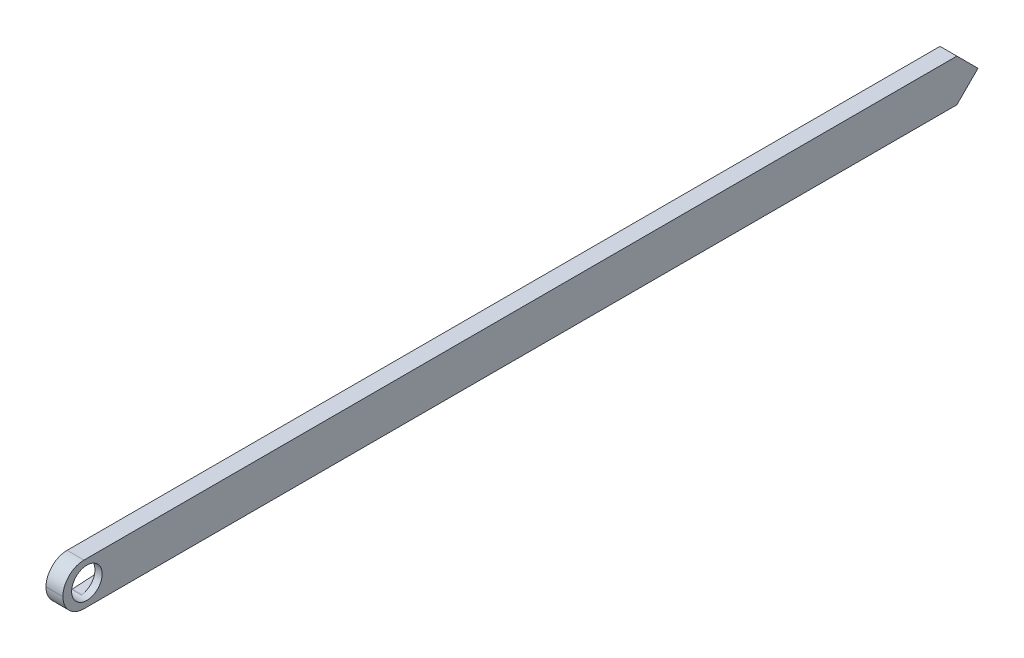
ISO-10303-21;
HEADER;
FILE_DESCRIPTION(('STEP AP214'),'2;1');
FILE_NAME('part.step','',(''),(''),'','','');
FILE_SCHEMA(('AUTOMOTIVE_DESIGN { 1 0 10303 214 1 1 1 1 }'));
ENDSEC;
DATA;
#1=APPLICATION_CONTEXT('core data for automotive mechanical design processes');
#2=APPLICATION_PROTOCOL_DEFINITION('international standard','automotive_design',2000,#1);
#3=PRODUCT_CONTEXT('',#1,'mechanical');
#4=PRODUCT('Part','Part','',(#3));
#5=PRODUCT_RELATED_PRODUCT_CATEGORY('part','',(#4));
#6=PRODUCT_DEFINITION_FORMATION('','',#4);
#7=PRODUCT_DEFINITION_CONTEXT('part definition',#1,'design');
#8=PRODUCT_DEFINITION('design','',#6,#7);
#9=PRODUCT_DEFINITION_SHAPE('','',#8);
#10=(LENGTH_UNIT() NAMED_UNIT(*) SI_UNIT(.MILLI.,.METRE.));
#11=(NAMED_UNIT(*) PLANE_ANGLE_UNIT() SI_UNIT($,.RADIAN.));
#12=(NAMED_UNIT(*) SI_UNIT($,.STERADIAN.) SOLID_ANGLE_UNIT());
#13=UNCERTAINTY_MEASURE_WITH_UNIT(LENGTH_MEASURE(1.E-05),#10,'distance_accuracy_value','');
#14=(GEOMETRIC_REPRESENTATION_CONTEXT(3) GLOBAL_UNCERTAINTY_ASSIGNED_CONTEXT((#13)) GLOBAL_UNIT_ASSIGNED_CONTEXT((#10,
#11,#12)) REPRESENTATION_CONTEXT('',''));
#15=CARTESIAN_POINT('',(0.,0.,0.));
#16=DIRECTION('',(0.,0.,1.));
#17=DIRECTION('',(1.,0.,0.));
#18=AXIS2_PLACEMENT_3D('',#15,#16,#17);
#19=CARTESIAN_POINT('',(4.,0.,0.));
#20=DIRECTION('',(0.,1.,0.));
#21=DIRECTION('',(0.,0.,1.));
#22=AXIS2_PLACEMENT_3D('',#19,#20,#21);
#23=PLANE('',#22);
#24=DIRECTION('',(0.,0.,-1.));
#25=VECTOR('',#24,1.);
#26=CARTESIAN_POINT('',(4.,0.,0.));
#27=LINE('',#26,#25);
#28=CARTESIAN_POINT('',(4.,0.,-5.));
#29=VERTEX_POINT('',#28);
#30=CARTESIAN_POINT('',(4.,0.,-211.86));
#31=VERTEX_POINT('',#30);
#32=EDGE_CURVE('E170',#29,#31,#27,.T.);
#33=ORIENTED_EDGE('',*,*,#32,.F.);
#34=DIRECTION('',(-1.,0.,0.));
#35=VECTOR('',#34,1.);
#36=CARTESIAN_POINT('',(0.,0.,-5.));
#37=LINE('',#36,#35);
#38=CARTESIAN_POINT('',(0.,0.,-5.));
#39=VERTEX_POINT('',#38);
#40=EDGE_CURVE('E208',#29,#39,#37,.T.);
#41=ORIENTED_EDGE('',*,*,#40,.T.);
#42=DIRECTION('',(0.,0.,-1.));
#43=VECTOR('',#42,1.);
#44=CARTESIAN_POINT('',(0.,0.,0.));
#45=LINE('',#44,#43);
#46=CARTESIAN_POINT('',(0.,0.,-211.86));
#47=VERTEX_POINT('',#46);
#48=EDGE_CURVE('E167',#39,#47,#45,.T.);
#49=ORIENTED_EDGE('',*,*,#48,.T.);
#50=DIRECTION('',(-1.,0.,0.));
#51=VECTOR('',#50,1.);
#52=CARTESIAN_POINT('',(4.,0.,-211.86));
#53=LINE('',#52,#51);
#54=EDGE_CURVE('E194',#31,#47,#53,.T.);
#55=ORIENTED_EDGE('',*,*,#54,.F.);
#56=EDGE_LOOP('',(#33,#41,#49,#55));
#57=FACE_BOUND('',#56,.T.);
#58=ADVANCED_FACE('F44',(#57),#23,.F.);
#59=CARTESIAN_POINT('',(4.,-105.93,-105.93));
#60=DIRECTION('',(0.,-0.707106781186548,-0.707106781186547));
#61=DIRECTION('',(0.,0.707106781186547,-0.707106781186548));
#62=AXIS2_PLACEMENT_3D('',#59,#60,#61);
#63=PLANE('',#62);
#64=DIRECTION('',(0.,-0.707106781186547,0.707106781186548));
#65=VECTOR('',#64,1.);
#66=CARTESIAN_POINT('',(0.,-105.93,-105.93));
#67=LINE('',#66,#65);
#68=CARTESIAN_POINT('',(0.,5.,-216.86));
#69=VERTEX_POINT('',#68);
#70=EDGE_CURVE('E183',#69,#47,#67,.T.);
#71=ORIENTED_EDGE('',*,*,#70,.F.);
#72=DIRECTION('',(-1.,0.,0.));
#73=VECTOR('',#72,1.);
#74=CARTESIAN_POINT('',(4.,5.,-216.86));
#75=LINE('',#74,#73);
#76=CARTESIAN_POINT('',(4.,5.,-216.86));
#77=VERTEX_POINT('',#76);
#78=EDGE_CURVE('E192',#77,#69,#75,.T.);
#79=ORIENTED_EDGE('',*,*,#78,.F.);
#80=DIRECTION('',(0.,-0.707106781186547,0.707106781186548));
#81=VECTOR('',#80,1.);
#82=CARTESIAN_POINT('',(4.,-105.93,-105.93));
#83=LINE('',#82,#81);
#84=EDGE_CURVE('E172',#77,#31,#83,.T.);
#85=ORIENTED_EDGE('',*,*,#84,.T.);
#86=ORIENTED_EDGE('',*,*,#54,.T.);
#87=EDGE_LOOP('',(#71,#79,#85,#86));
#88=FACE_BOUND('',#87,.T.);
#89=ADVANCED_FACE('F253',(#88),#63,.T.);
#90=CARTESIAN_POINT('',(4.,110.93,-110.93));
#91=DIRECTION('',(0.,0.707106781186548,-0.707106781186547));
#92=DIRECTION('',(0.,0.707106781186547,0.707106781186548));
#93=AXIS2_PLACEMENT_3D('',#90,#91,#92);
#94=PLANE('',#93);
#95=DIRECTION('',(0.,-0.707106781186547,-0.707106781186548));
#96=VECTOR('',#95,1.);
#97=CARTESIAN_POINT('',(0.,110.93,-110.93));
#98=LINE('',#97,#96);
#99=CARTESIAN_POINT('',(0.,10.,-211.86));
#100=VERTEX_POINT('',#99);
#101=EDGE_CURVE('E186',#100,#69,#98,.T.);
#102=ORIENTED_EDGE('',*,*,#101,.F.);
#103=DIRECTION('',(-1.,0.,0.));
#104=VECTOR('',#103,1.);
#105=CARTESIAN_POINT('',(4.,10.,-211.86));
#106=LINE('',#105,#104);
#107=CARTESIAN_POINT('',(4.,10.,-211.86));
#108=VERTEX_POINT('',#107);
#109=EDGE_CURVE('E181',#108,#100,#106,.T.);
#110=ORIENTED_EDGE('',*,*,#109,.F.);
#111=DIRECTION('',(0.,-0.707106781186547,-0.707106781186548));
#112=VECTOR('',#111,1.);
#113=CARTESIAN_POINT('',(4.,110.93,-110.93));
#114=LINE('',#113,#112);
#115=EDGE_CURVE('E176',#108,#77,#114,.T.);
#116=ORIENTED_EDGE('',*,*,#115,.T.);
#117=ORIENTED_EDGE('',*,*,#78,.T.);
#118=EDGE_LOOP('',(#102,#110,#116,#117));
#119=FACE_BOUND('',#118,.T.);
#120=ADVANCED_FACE('F261',(#119),#94,.T.);
#121=CARTESIAN_POINT('',(4.,10.,0.));
#122=DIRECTION('',(0.,1.,0.));
#123=DIRECTION('',(0.,0.,1.));
#124=AXIS2_PLACEMENT_3D('',#121,#122,#123);
#125=PLANE('',#124);
#126=DIRECTION('',(0.,0.,-1.));
#127=VECTOR('',#126,1.);
#128=CARTESIAN_POINT('',(0.,10.,0.));
#129=LINE('',#128,#127);
#130=CARTESIAN_POINT('',(0.,10.,-5.));
#131=VERTEX_POINT('',#130);
#132=EDGE_CURVE('E173',#131,#100,#129,.T.);
#133=ORIENTED_EDGE('',*,*,#132,.F.);
#134=DIRECTION('',(-1.,0.,0.));
#135=VECTOR('',#134,1.);
#136=CARTESIAN_POINT('',(4.,10.,-5.));
#137=LINE('',#136,#135);
#138=CARTESIAN_POINT('',(4.,10.,-5.));
#139=VERTEX_POINT('',#138);
#140=EDGE_CURVE('E201',#131,#139,#137,.F.);
#141=ORIENTED_EDGE('',*,*,#140,.T.);
#142=DIRECTION('',(0.,0.,-1.));
#143=VECTOR('',#142,1.);
#144=CARTESIAN_POINT('',(4.,10.,0.));
#145=LINE('',#144,#143);
#146=EDGE_CURVE('E179',#139,#108,#145,.T.);
#147=ORIENTED_EDGE('',*,*,#146,.T.);
#148=ORIENTED_EDGE('',*,*,#109,.T.);
#149=EDGE_LOOP('',(#133,#141,#147,#148));
#150=FACE_BOUND('',#149,.T.);
#151=ADVANCED_FACE('F347',(#150),#125,.T.);
#152=CARTESIAN_POINT('',(4.,0.,0.));
#153=DIRECTION('',(1.,0.,0.));
#154=DIRECTION('',(0.,0.,-1.));
#155=AXIS2_PLACEMENT_3D('',#152,#153,#154);
#156=PLANE('',#155);
#157=CARTESIAN_POINT('',(4.,5.,-5.68959999999999));
#158=DIRECTION('',(-1.,0.,0.));
#159=DIRECTION('',(0.,0.,1.));
#160=AXIS2_PLACEMENT_3D('',#157,#158,#159);
#161=CIRCLE('',#160,3.61);
#162=CARTESIAN_POINT('',(4.,5.,-2.07959999999999));
#163=VERTEX_POINT('',#162);
#164=EDGE_CURVE('E164',#163,#163,#161,.T.);
#165=ORIENTED_EDGE('',*,*,#164,.T.);
#166=EDGE_LOOP('',(#165));
#167=FACE_BOUND('',#166,.T.);
#168=ORIENTED_EDGE('',*,*,#146,.F.);
#169=CARTESIAN_POINT('',(4.,5.,-5.));
#170=DIRECTION('',(1.,0.,0.));
#171=DIRECTION('',(0.,0.,-1.));
#172=AXIS2_PLACEMENT_3D('',#169,#170,#171);
#173=CIRCLE('',#172,5.);
#174=CARTESIAN_POINT('',(4.,5.,0.));
#175=VERTEX_POINT('',#174);
#176=EDGE_CURVE('E206',#139,#175,#173,.T.);
#177=ORIENTED_EDGE('',*,*,#176,.T.);
#178=CARTESIAN_POINT('',(4.,5.,-5.));
#179=DIRECTION('',(1.,0.,0.));
#180=DIRECTION('',(0.,0.,-1.));
#181=AXIS2_PLACEMENT_3D('',#178,#179,#180);
#182=CIRCLE('',#181,5.);
#183=EDGE_CURVE('E204',#175,#29,#182,.T.);
#184=ORIENTED_EDGE('',*,*,#183,.T.);
#185=ORIENTED_EDGE('',*,*,#32,.T.);
#186=ORIENTED_EDGE('',*,*,#84,.F.);
#187=ORIENTED_EDGE('',*,*,#115,.F.);
#188=EDGE_LOOP('',(#168,#177,#184,#185,#186,#187));
#189=FACE_BOUND('',#188,.T.);
#190=ADVANCED_FACE('F336',(#167,#189),#156,.T.);
#191=CARTESIAN_POINT('',(0.,0.,0.));
#192=DIRECTION('',(1.,0.,0.));
#193=DIRECTION('',(0.,0.,-1.));
#194=AXIS2_PLACEMENT_3D('',#191,#192,#193);
#195=PLANE('',#194);
#196=CARTESIAN_POINT('',(0.,5.,-5.68959999999999));
#197=DIRECTION('',(-1.,0.,0.));
#198=DIRECTION('',(0.,0.,1.));
#199=AXIS2_PLACEMENT_3D('',#196,#197,#198);
#200=CIRCLE('',#199,3.61);
#201=CARTESIAN_POINT('',(0.,1.41422947388331,-6.10715207343855));
#202=VERTEX_POINT('',#201);
#203=CARTESIAN_POINT('',(0.,8.58577052611669,-6.10715207343855));
#204=VERTEX_POINT('',#203);
#205=EDGE_CURVE('E163',#202,#204,#200,.T.);
#206=ORIENTED_EDGE('',*,*,#205,.F.);
#207=CARTESIAN_POINT('',(0.,-0.572346994879395,-6.33848286204717));
#208=DIRECTION('',(1.,0.,0.));
#209=DIRECTION('',(0.,0.,-1.));
#210=AXIS2_PLACEMENT_3D('',#207,#208,#209);
#211=CIRCLE('',#210,2.);
#212=CARTESIAN_POINT('',(0.,1.42370032577866,-6.21280432890096));
#213=VERTEX_POINT('',#212);
#214=EDGE_CURVE('E220',#202,#213,#211,.F.);
#215=ORIENTED_EDGE('',*,*,#214,.T.);
#216=DIRECTION('',(0.,-0.062839266573108,0.998023660329029));
#217=VECTOR('',#216,1.);
#218=CARTESIAN_POINT('',(0.,1.02844196733036,0.0647545158586101));
#219=LINE('',#218,#217);
#220=CARTESIAN_POINT('',(0.,2.495,-23.2273635445432));
#221=VERTEX_POINT('',#220);
#222=EDGE_CURVE('E150',#221,#213,#219,.T.);
#223=ORIENTED_EDGE('',*,*,#222,.F.);
#224=CARTESIAN_POINT('',(0.,5.,-23.0696394654229));
#225=DIRECTION('',(-1.,0.,0.));
#226=DIRECTION('',(0.,0.,1.));
#227=AXIS2_PLACEMENT_3D('',#224,#225,#226);
#228=CIRCLE('',#227,2.50996053457706);
#229=CARTESIAN_POINT('',(0.,7.505,-23.2273635445432));
#230=VERTEX_POINT('',#229);
#231=EDGE_CURVE('E146',#230,#221,#228,.T.);
#232=ORIENTED_EDGE('',*,*,#231,.F.);
#233=DIRECTION('',(0.,-0.062839266573108,-0.998023660329029));
#234=VECTOR('',#233,1.);
#235=CARTESIAN_POINT('',(0.,8.93207029843518,-0.562396232518238));
#236=LINE('',#235,#234);
#237=CARTESIAN_POINT('',(0.,8.57629967422134,-6.21280432890096));
#238=VERTEX_POINT('',#237);
#239=EDGE_CURVE('E155',#238,#230,#236,.T.);
#240=ORIENTED_EDGE('',*,*,#239,.F.);
#241=CARTESIAN_POINT('',(0.,10.5723469948794,-6.33848286204717));
#242=DIRECTION('',(1.,0.,0.));
#243=DIRECTION('',(0.,0.,-1.));
#244=AXIS2_PLACEMENT_3D('',#241,#242,#243);
#245=CIRCLE('',#244,2.);
#246=EDGE_CURVE('E218',#238,#204,#245,.F.);
#247=ORIENTED_EDGE('',*,*,#246,.T.);
#248=EDGE_LOOP('',(#206,#215,#223,#232,#240,#247));
#249=FACE_BOUND('',#248,.T.);
#250=CARTESIAN_POINT('',(0.,5.,-5.));
#251=DIRECTION('',(1.,0.,0.));
#252=DIRECTION('',(0.,0.,-1.));
#253=AXIS2_PLACEMENT_3D('',#250,#251,#252);
#254=CIRCLE('',#253,5.);
#255=CARTESIAN_POINT('',(0.,5.,0.));
#256=VERTEX_POINT('',#255);
#257=EDGE_CURVE('E197',#39,#256,#254,.F.);
#258=ORIENTED_EDGE('',*,*,#257,.T.);
#259=CARTESIAN_POINT('',(0.,5.,-5.));
#260=DIRECTION('',(1.,0.,0.));
#261=DIRECTION('',(0.,0.,-1.));
#262=AXIS2_PLACEMENT_3D('',#259,#260,#261);
#263=CIRCLE('',#262,5.);
#264=EDGE_CURVE('E199',#256,#131,#263,.F.);
#265=ORIENTED_EDGE('',*,*,#264,.T.);
#266=ORIENTED_EDGE('',*,*,#132,.T.);
#267=ORIENTED_EDGE('',*,*,#101,.T.);
#268=ORIENTED_EDGE('',*,*,#70,.T.);
#269=ORIENTED_EDGE('',*,*,#48,.F.);
#270=EDGE_LOOP('',(#258,#265,#266,#267,#268,#269));
#271=FACE_BOUND('',#270,.T.);
#272=ADVANCED_FACE('F233',(#249,#271),#195,.F.);
#273=CARTESIAN_POINT('',(4.,5.,-5.68959999999999));
#274=DIRECTION('',(-1.,0.,0.));
#275=DIRECTION('',(0.,0.,1.));
#276=AXIS2_PLACEMENT_3D('',#273,#274,#275);
#277=CYLINDRICAL_SURFACE('',#276,3.61);
#278=ORIENTED_EDGE('',*,*,#164,.F.);
#279=EDGE_LOOP('',(#278));
#280=FACE_BOUND('',#279,.T.);
#281=CARTESIAN_POINT('',(2.3,5.,-5.68959999999999));
#282=DIRECTION('',(1.,0.,0.));
#283=DIRECTION('',(0.,0.,-1.));
#284=AXIS2_PLACEMENT_3D('',#281,#282,#283);
#285=CIRCLE('',#284,3.61);
#286=CARTESIAN_POINT('',(2.3,8.58577052611669,-6.10715207343855));
#287=VERTEX_POINT('',#286);
#288=CARTESIAN_POINT('',(2.3,1.41422947388331,-6.10715207343855));
#289=VERTEX_POINT('',#288);
#290=EDGE_CURVE('E159',#287,#289,#285,.F.);
#291=ORIENTED_EDGE('',*,*,#290,.T.);
#292=DIRECTION('',(-1.,0.,0.));
#293=VECTOR('',#292,1.);
#294=CARTESIAN_POINT('',(4.,1.41422947388331,-6.10715207343855));
#295=LINE('',#294,#293);
#296=EDGE_CURVE('E215',#289,#202,#295,.T.);
#297=ORIENTED_EDGE('',*,*,#296,.T.);
#298=ORIENTED_EDGE('',*,*,#205,.T.);
#299=DIRECTION('',(-1.,0.,0.));
#300=VECTOR('',#299,1.);
#301=CARTESIAN_POINT('',(4.,8.58577052611669,-6.10715207343855));
#302=LINE('',#301,#300);
#303=EDGE_CURVE('E210',#204,#287,#302,.F.);
#304=ORIENTED_EDGE('',*,*,#303,.T.);
#305=EDGE_LOOP('',(#291,#297,#298,#304));
#306=FACE_BOUND('',#305,.T.);
#307=ADVANCED_FACE('F230',(#280,#306),#277,.F.);
#308=CARTESIAN_POINT('',(2.3,0.,0.));
#309=DIRECTION('',(1.,0.,0.));
#310=DIRECTION('',(0.,0.,-1.));
#311=AXIS2_PLACEMENT_3D('',#308,#309,#310);
#312=PLANE('',#311);
#313=ORIENTED_EDGE('',*,*,#290,.F.);
#314=CARTESIAN_POINT('',(2.3,10.5723469948794,-6.33848286204717));
#315=DIRECTION('',(1.,0.,0.));
#316=DIRECTION('',(0.,0.,-1.));
#317=AXIS2_PLACEMENT_3D('',#314,#315,#316);
#318=CIRCLE('',#317,2.);
#319=CARTESIAN_POINT('',(2.3,8.57629967422134,-6.21280432890096));
#320=VERTEX_POINT('',#319);
#321=EDGE_CURVE('E12',#287,#320,#318,.T.);
#322=ORIENTED_EDGE('',*,*,#321,.T.);
#323=DIRECTION('',(0.,-0.062839266573108,-0.998023660329029));
#324=VECTOR('',#323,1.);
#325=CARTESIAN_POINT('',(2.3,8.93207029843518,-0.562396232518238));
#326=LINE('',#325,#324);
#327=CARTESIAN_POINT('',(2.3,7.505,-23.2273635445432));
#328=VERTEX_POINT('',#327);
#329=EDGE_CURVE('E137',#320,#328,#326,.T.);
#330=ORIENTED_EDGE('',*,*,#329,.T.);
#331=CARTESIAN_POINT('',(2.3,5.,-23.0696394654229));
#332=DIRECTION('',(1.,0.,0.));
#333=DIRECTION('',(0.,0.,-1.));
#334=AXIS2_PLACEMENT_3D('',#331,#332,#333);
#335=CIRCLE('',#334,2.50996053457706);
#336=CARTESIAN_POINT('',(2.30000000000001,2.495,-23.2273635445432));
#337=VERTEX_POINT('',#336);
#338=EDGE_CURVE('E143',#328,#337,#335,.F.);
#339=ORIENTED_EDGE('',*,*,#338,.T.);
#340=DIRECTION('',(0.,-0.062839266573108,0.998023660329029));
#341=VECTOR('',#340,1.);
#342=CARTESIAN_POINT('',(2.3,1.02844196733036,0.0647545158586101));
#343=LINE('',#342,#341);
#344=CARTESIAN_POINT('',(2.3,1.42370032577866,-6.21280432890096));
#345=VERTEX_POINT('',#344);
#346=EDGE_CURVE('E129',#337,#345,#343,.T.);
#347=ORIENTED_EDGE('',*,*,#346,.T.);
#348=CARTESIAN_POINT('',(2.3,-0.572346994879395,-6.33848286204717));
#349=DIRECTION('',(1.,0.,0.));
#350=DIRECTION('',(0.,0.,-1.));
#351=AXIS2_PLACEMENT_3D('',#348,#349,#350);
#352=CIRCLE('',#351,2.);
#353=EDGE_CURVE('E52',#345,#289,#352,.T.);
#354=ORIENTED_EDGE('',*,*,#353,.T.);
#355=EDGE_LOOP('',(#313,#322,#330,#339,#347,#354));
#356=FACE_BOUND('',#355,.T.);
#357=ADVANCED_FACE('F149',(#356),#312,.F.);
#358=CARTESIAN_POINT('',(24.703095664644,5.,-23.0696394654229));
#359=DIRECTION('',(-1.,0.,0.));
#360=DIRECTION('',(0.,0.,1.));
#361=AXIS2_PLACEMENT_3D('',#358,#359,#360);
#362=CYLINDRICAL_SURFACE('',#361,2.50996053457706);
#363=DIRECTION('',(-1.,0.,0.));
#364=VECTOR('',#363,1.);
#365=CARTESIAN_POINT('',(24.703095664644,7.505,-23.2273635445432));
#366=LINE('',#365,#364);
#367=EDGE_CURVE('E158',#328,#230,#366,.T.);
#368=ORIENTED_EDGE('',*,*,#367,.T.);
#369=ORIENTED_EDGE('',*,*,#231,.T.);
#370=DIRECTION('',(-1.,0.,0.));
#371=VECTOR('',#370,1.);
#372=CARTESIAN_POINT('',(24.703095664644,2.495,-23.2273635445432));
#373=LINE('',#372,#371);
#374=EDGE_CURVE('E132',#337,#221,#373,.T.);
#375=ORIENTED_EDGE('',*,*,#374,.F.);
#376=ORIENTED_EDGE('',*,*,#338,.F.);
#377=EDGE_LOOP('',(#368,#369,#375,#376));
#378=FACE_BOUND('',#377,.T.);
#379=ADVANCED_FACE('F142',(#378),#362,.F.);
#380=CARTESIAN_POINT('',(24.703095664644,1.02844196733036,0.0647545158586101));
#381=DIRECTION('',(0.,-0.998023660329029,-0.062839266573108));
#382=DIRECTION('',(0.,0.062839266573108,-0.998023660329029));
#383=AXIS2_PLACEMENT_3D('',#380,#381,#382);
#384=PLANE('',#383);
#385=ORIENTED_EDGE('',*,*,#222,.T.);
#386=DIRECTION('',(-1.,0.,0.));
#387=VECTOR('',#386,1.);
#388=CARTESIAN_POINT('',(24.703095664644,1.42370032577866,-6.21280432890096));
#389=LINE('',#388,#387);
#390=EDGE_CURVE('E65',#213,#345,#389,.F.);
#391=ORIENTED_EDGE('',*,*,#390,.T.);
#392=ORIENTED_EDGE('',*,*,#346,.F.);
#393=ORIENTED_EDGE('',*,*,#374,.T.);
#394=EDGE_LOOP('',(#385,#391,#392,#393));
#395=FACE_BOUND('',#394,.T.);
#396=ADVANCED_FACE('F131',(#395),#384,.F.);
#397=CARTESIAN_POINT('',(24.703095664644,8.93207029843518,-0.562396232518238));
#398=DIRECTION('',(0.,0.998023660329029,-0.062839266573108));
#399=DIRECTION('',(0.,0.062839266573108,0.998023660329029));
#400=AXIS2_PLACEMENT_3D('',#397,#398,#399);
#401=PLANE('',#400);
#402=ORIENTED_EDGE('',*,*,#329,.F.);
#403=DIRECTION('',(-1.,0.,0.));
#404=VECTOR('',#403,1.);
#405=CARTESIAN_POINT('',(24.703095664644,8.57629967422134,-6.21280432890096));
#406=LINE('',#405,#404);
#407=EDGE_CURVE('E223',#320,#238,#406,.T.);
#408=ORIENTED_EDGE('',*,*,#407,.T.);
#409=ORIENTED_EDGE('',*,*,#239,.T.);
#410=ORIENTED_EDGE('',*,*,#367,.F.);
#411=EDGE_LOOP('',(#402,#408,#409,#410));
#412=FACE_BOUND('',#411,.T.);
#413=ADVANCED_FACE('F239',(#412),#401,.F.);
#414=CARTESIAN_POINT('',(4.,5.,-5.));
#415=DIRECTION('',(1.,0.,0.));
#416=DIRECTION('',(0.,0.,-1.));
#417=AXIS2_PLACEMENT_3D('',#414,#415,#416);
#418=CYLINDRICAL_SURFACE('',#417,5.);
#419=ORIENTED_EDGE('',*,*,#40,.F.);
#420=ORIENTED_EDGE('',*,*,#183,.F.);
#421=DIRECTION('',(-1.,0.,0.));
#422=VECTOR('',#421,1.);
#423=CARTESIAN_POINT('',(4.,5.,0.));
#424=LINE('',#423,#422);
#425=EDGE_CURVE('E160',#256,#175,#424,.F.);
#426=ORIENTED_EDGE('',*,*,#425,.F.);
#427=ORIENTED_EDGE('',*,*,#257,.F.);
#428=EDGE_LOOP('',(#419,#420,#426,#427));
#429=FACE_BOUND('',#428,.T.);
#430=ADVANCED_FACE('F241',(#429),#418,.T.);
#431=CARTESIAN_POINT('',(4.,5.,-5.));
#432=DIRECTION('',(-1.,0.,0.));
#433=DIRECTION('',(0.,0.,1.));
#434=AXIS2_PLACEMENT_3D('',#431,#432,#433);
#435=CYLINDRICAL_SURFACE('',#434,5.);
#436=ORIENTED_EDGE('',*,*,#176,.F.);
#437=ORIENTED_EDGE('',*,*,#140,.F.);
#438=ORIENTED_EDGE('',*,*,#264,.F.);
#439=ORIENTED_EDGE('',*,*,#425,.T.);
#440=EDGE_LOOP('',(#436,#437,#438,#439));
#441=FACE_BOUND('',#440,.T.);
#442=ADVANCED_FACE('F248',(#441),#435,.T.);
#443=CARTESIAN_POINT('',(4.,-0.572346994879395,-6.33848286204717));
#444=DIRECTION('',(-1.,0.,0.));
#445=DIRECTION('',(0.,0.,1.));
#446=AXIS2_PLACEMENT_3D('',#443,#444,#445);
#447=CYLINDRICAL_SURFACE('',#446,2.);
#448=ORIENTED_EDGE('',*,*,#353,.F.);
#449=ORIENTED_EDGE('',*,*,#390,.F.);
#450=ORIENTED_EDGE('',*,*,#214,.F.);
#451=ORIENTED_EDGE('',*,*,#296,.F.);
#452=EDGE_LOOP('',(#448,#449,#450,#451));
#453=FACE_BOUND('',#452,.T.);
#454=ADVANCED_FACE('F227',(#453),#447,.T.);
#455=CARTESIAN_POINT('',(4.,10.5723469948794,-6.33848286204717));
#456=DIRECTION('',(-1.,0.,0.));
#457=DIRECTION('',(0.,0.,1.));
#458=AXIS2_PLACEMENT_3D('',#455,#456,#457);
#459=CYLINDRICAL_SURFACE('',#458,2.);
#460=ORIENTED_EDGE('',*,*,#321,.F.);
#461=ORIENTED_EDGE('',*,*,#303,.F.);
#462=ORIENTED_EDGE('',*,*,#246,.F.);
#463=ORIENTED_EDGE('',*,*,#407,.F.);
#464=EDGE_LOOP('',(#460,#461,#462,#463));
#465=FACE_BOUND('',#464,.T.);
#466=ADVANCED_FACE('F46',(#465),#459,.T.);
#467=CLOSED_SHELL('',(#58,#89,#120,#151,#190,#272,#307,#357,#379,#396,#413,#430,#442,#454,#466));
#468=MANIFOLD_SOLID_BREP('B2',#467);
#469=ADVANCED_BREP_SHAPE_REPRESENTATION('',(#18,#468),#14);
#470=SHAPE_DEFINITION_REPRESENTATION(#9,#469);
ENDSEC;
END-ISO-10303-21;
